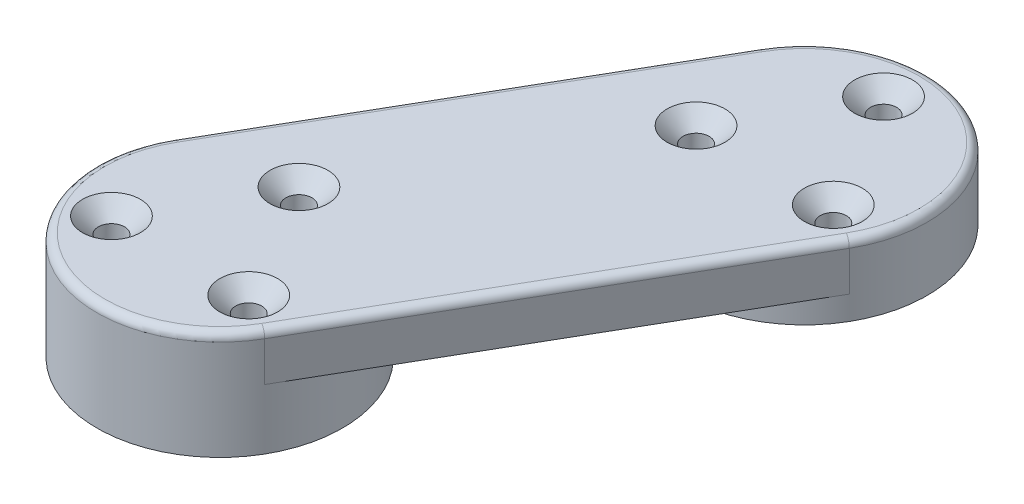
ISO-10303-21;
HEADER;
FILE_DESCRIPTION(('STEP AP214'),'2;1');
FILE_NAME('part.step','',(''),(''),'','','');
FILE_SCHEMA(('AUTOMOTIVE_DESIGN { 1 0 10303 214 1 1 1 1 }'));
ENDSEC;
DATA;
#1=APPLICATION_CONTEXT('core data for automotive mechanical design processes');
#2=APPLICATION_PROTOCOL_DEFINITION('international standard','automotive_design',2000,#1);
#3=PRODUCT_CONTEXT('',#1,'mechanical');
#4=PRODUCT('Part','Part','',(#3));
#5=PRODUCT_RELATED_PRODUCT_CATEGORY('part','',(#4));
#6=PRODUCT_DEFINITION_FORMATION('','',#4);
#7=PRODUCT_DEFINITION_CONTEXT('part definition',#1,'design');
#8=PRODUCT_DEFINITION('design','',#6,#7);
#9=PRODUCT_DEFINITION_SHAPE('','',#8);
#10=(LENGTH_UNIT() NAMED_UNIT(*) SI_UNIT(.MILLI.,.METRE.));
#11=(NAMED_UNIT(*) PLANE_ANGLE_UNIT() SI_UNIT($,.RADIAN.));
#12=(NAMED_UNIT(*) SI_UNIT($,.STERADIAN.) SOLID_ANGLE_UNIT());
#13=UNCERTAINTY_MEASURE_WITH_UNIT(LENGTH_MEASURE(1.E-05),#10,'distance_accuracy_value','');
#14=(GEOMETRIC_REPRESENTATION_CONTEXT(3) GLOBAL_UNCERTAINTY_ASSIGNED_CONTEXT((#13)) GLOBAL_UNIT_ASSIGNED_CONTEXT((#10,
#11,#12)) REPRESENTATION_CONTEXT('',''));
#15=CARTESIAN_POINT('',(0.,0.,0.));
#16=DIRECTION('',(0.,0.,1.));
#17=DIRECTION('',(1.,0.,0.));
#18=AXIS2_PLACEMENT_3D('',#15,#16,#17);
#19=CARTESIAN_POINT('',(2.25126265847072,-64.,-99.5141091458864));
#20=DIRECTION('',(0.,-1.,0.));
#21=DIRECTION('',(0.,0.,-1.));
#22=AXIS2_PLACEMENT_3D('',#19,#20,#21);
#23=PLANE('',#22);
#24=CARTESIAN_POINT('',(2.25126265847072,-64.,-99.5141091458864));
#25=DIRECTION('',(0.,-1.,0.));
#26=DIRECTION('',(0.5,0.,-0.86602540378444));
#27=AXIS2_PLACEMENT_3D('',#24,#25,#26);
#28=CIRCLE('',#27,13.55);
#29=CARTESIAN_POINT('',(9.0262626584707,-64.,-111.248753367166));
#30=VERTEX_POINT('',#29);
#31=EDGE_CURVE('E10',#30,#30,#28,.T.);
#32=ORIENTED_EDGE('',*,*,#31,.F.);
#33=EDGE_LOOP('',(#32));
#34=FACE_BOUND('',#33,.T.);
#35=CARTESIAN_POINT('',(2.25126265847072,-64.,-99.5141091458864));
#36=DIRECTION('',(0.,-1.,0.));
#37=DIRECTION('',(0.5,0.,-0.86602540378444));
#38=AXIS2_PLACEMENT_3D('',#35,#36,#37);
#39=CIRCLE('',#38,15.4999999999947);
#40=CARTESIAN_POINT('',(10.0012626584681,-64.,-112.937502904541));
#41=VERTEX_POINT('',#40);
#42=EDGE_CURVE('E227',#41,#41,#39,.T.);
#43=ORIENTED_EDGE('',*,*,#42,.T.);
#44=EDGE_LOOP('',(#43));
#45=FACE_BOUND('',#44,.T.);
#46=ADVANCED_FACE('F15',(#34,#45),#23,.T.);
#47=CARTESIAN_POINT('',(2.25126265847072,-64.,-99.5141091458864));
#48=DIRECTION('',(0.,1.,0.));
#49=DIRECTION('',(-0.5,0.,0.86602540378444));
#50=AXIS2_PLACEMENT_3D('',#47,#48,#49);
#51=CYLINDRICAL_SURFACE('',#50,13.55);
#52=CARTESIAN_POINT('',(2.25126265847072,-63.,-99.5141091458864));
#53=DIRECTION('',(0.,-1.,0.));
#54=DIRECTION('',(0.5,0.,-0.86602540378444));
#55=AXIS2_PLACEMENT_3D('',#52,#53,#54);
#56=CIRCLE('',#55,13.55);
#57=CARTESIAN_POINT('',(9.0262626584707,-63.,-111.248753367166));
#58=VERTEX_POINT('',#57);
#59=EDGE_CURVE('E194',#58,#58,#56,.T.);
#60=ORIENTED_EDGE('',*,*,#59,.F.);
#61=EDGE_LOOP('',(#60));
#62=FACE_BOUND('',#61,.T.);
#63=ORIENTED_EDGE('',*,*,#31,.T.);
#64=EDGE_LOOP('',(#63));
#65=FACE_BOUND('',#64,.T.);
#66=ADVANCED_FACE('F381',(#62,#65),#51,.F.);
#67=CARTESIAN_POINT('',(2.25126265847072,-56.,-99.5141091458864));
#68=DIRECTION('',(0.,1.,0.));
#69=DIRECTION('',(-0.5,0.,0.86602540378444));
#70=AXIS2_PLACEMENT_3D('',#67,#68,#69);
#71=TOROIDAL_SURFACE('',#70,14.4999999999947,1.);
#72=CARTESIAN_POINT('',(14.8086310133405,-56.,-92.2641091458891));
#73=DIRECTION('',(0.5,0.,-0.86602540378444));
#74=DIRECTION('',(0.,1.,0.));
#75=AXIS2_PLACEMENT_3D('',#72,#73,#74);
#76=CIRCLE('',#75,1.);
#77=CARTESIAN_POINT('',(14.8086310133405,-55.,-92.2641091458891));
#78=VERTEX_POINT('',#77);
#79=CARTESIAN_POINT('',(15.6746564171249,-56.,-91.7641091458891));
#80=VERTEX_POINT('',#79);
#81=EDGE_CURVE('E233',#78,#80,#76,.T.);
#82=ORIENTED_EDGE('',*,*,#81,.T.);
#83=CARTESIAN_POINT('',(2.25126265847072,-56.,-99.5141091458864));
#84=DIRECTION('',(0.,-1.,0.));
#85=DIRECTION('',(-0.5,0.,0.86602540378444));
#86=AXIS2_PLACEMENT_3D('',#83,#84,#85);
#87=CIRCLE('',#86,15.4999999999947);
#88=CARTESIAN_POINT('',(-11.1721311001835,-56.,-107.264109145884));
#89=VERTEX_POINT('',#88);
#90=EDGE_CURVE('E208',#89,#80,#87,.T.);
#91=ORIENTED_EDGE('',*,*,#90,.F.);
#92=CARTESIAN_POINT('',(-10.3061056963991,-56.,-106.764109145884));
#93=DIRECTION('',(0.5,0.,-0.86602540378444));
#94=DIRECTION('',(0.,1.,0.));
#95=AXIS2_PLACEMENT_3D('',#92,#93,#94);
#96=CIRCLE('',#95,1.);
#97=CARTESIAN_POINT('',(-10.3061056963991,-55.,-106.764109145884));
#98=VERTEX_POINT('',#97);
#99=EDGE_CURVE('E23',#89,#98,#96,.T.);
#100=ORIENTED_EDGE('',*,*,#99,.T.);
#101=CARTESIAN_POINT('',(2.25126265847072,-55.,-99.5141091458864));
#102=DIRECTION('',(0.,1.,0.));
#103=DIRECTION('',(-0.5,0.,0.86602540378444));
#104=AXIS2_PLACEMENT_3D('',#101,#102,#103);
#105=CIRCLE('',#104,14.4999999999947);
#106=EDGE_CURVE('E244',#78,#98,#105,.T.);
#107=ORIENTED_EDGE('',*,*,#106,.F.);
#108=EDGE_LOOP('',(#82,#91,#100,#107));
#109=FACE_BOUND('',#108,.T.);
#110=ADVANCED_FACE('F323',(#109),#71,.T.);
#111=CARTESIAN_POINT('',(-10.3061056963991,-56.,-106.764109145884));
#112=DIRECTION('',(-0.5,0.,0.86602540378444));
#113=DIRECTION('',(0.,-1.,0.));
#114=AXIS2_PLACEMENT_3D('',#111,#112,#113);
#115=CYLINDRICAL_SURFACE('',#114,1.);
#116=CARTESIAN_POINT('',(-37.3061056963989,-56.,-59.9987373415241));
#117=DIRECTION('',(0.5,0.,-0.866025403784438));
#118=DIRECTION('',(0.866025403784438,0.,0.5));
#119=AXIS2_PLACEMENT_3D('',#116,#117,#118);
#120=CIRCLE('',#119,1.);
#121=CARTESIAN_POINT('',(-38.1721311001834,-56.,-60.4987373415241));
#122=VERTEX_POINT('',#121);
#123=CARTESIAN_POINT('',(-37.306105696399,-55.,-59.9987373415241));
#124=VERTEX_POINT('',#123);
#125=EDGE_CURVE('E234',#122,#124,#120,.T.);
#126=ORIENTED_EDGE('',*,*,#125,.T.);
#127=DIRECTION('',(-0.5,0.,0.86602540378444));
#128=VECTOR('',#127,1.);
#129=CARTESIAN_POINT('',(-10.3061056963991,-55.,-106.764109145884));
#130=LINE('',#129,#128);
#131=EDGE_CURVE('E248',#98,#124,#130,.T.);
#132=ORIENTED_EDGE('',*,*,#131,.F.);
#133=ORIENTED_EDGE('',*,*,#99,.F.);
#134=DIRECTION('',(0.5,0.,-0.86602540378444));
#135=VECTOR('',#134,1.);
#136=CARTESIAN_POINT('',(-11.1721311001835,-56.,-107.264109145884));
#137=LINE('',#136,#135);
#138=EDGE_CURVE('E308',#122,#89,#137,.T.);
#139=ORIENTED_EDGE('',*,*,#138,.F.);
#140=EDGE_LOOP('',(#126,#132,#133,#139));
#141=FACE_BOUND('',#140,.T.);
#142=ADVANCED_FACE('F326',(#141),#115,.T.);
#143=CARTESIAN_POINT('',(14.8086310133405,-56.,-92.2641091458891));
#144=DIRECTION('',(0.5,0.,-0.86602540378444));
#145=DIRECTION('',(0.,1.,0.));
#146=AXIS2_PLACEMENT_3D('',#143,#144,#145);
#147=CYLINDRICAL_SURFACE('',#146,1.);
#148=CARTESIAN_POINT('',(-12.1913689866594,-56.,-45.4987373415293));
#149=DIRECTION('',(0.5,0.,-0.86602540378444));
#150=DIRECTION('',(0.,1.,0.));
#151=AXIS2_PLACEMENT_3D('',#148,#149,#150);
#152=CIRCLE('',#151,1.);
#153=CARTESIAN_POINT('',(-12.1913689866594,-55.,-45.4987373415293));
#154=VERTEX_POINT('',#153);
#155=CARTESIAN_POINT('',(-11.325343582875,-56.,-44.9987373415293));
#156=VERTEX_POINT('',#155);
#157=EDGE_CURVE('E230',#154,#156,#152,.T.);
#158=ORIENTED_EDGE('',*,*,#157,.T.);
#159=DIRECTION('',(-0.5,0.,0.86602540378444));
#160=VECTOR('',#159,1.);
#161=CARTESIAN_POINT('',(-11.325343582875,-56.,-44.9987373415293));
#162=LINE('',#161,#160);
#163=EDGE_CURVE('E299',#80,#156,#162,.T.);
#164=ORIENTED_EDGE('',*,*,#163,.F.);
#165=ORIENTED_EDGE('',*,*,#81,.F.);
#166=DIRECTION('',(0.5,0.,-0.86602540378444));
#167=VECTOR('',#166,1.);
#168=CARTESIAN_POINT('',(14.8086310133405,-55.,-92.2641091458891));
#169=LINE('',#168,#167);
#170=EDGE_CURVE('E249',#154,#78,#169,.T.);
#171=ORIENTED_EDGE('',*,*,#170,.F.);
#172=EDGE_LOOP('',(#158,#164,#165,#171));
#173=FACE_BOUND('',#172,.T.);
#174=ADVANCED_FACE('F333',(#173),#147,.T.);
#175=CARTESIAN_POINT('',(-24.7487373415292,-56.,-52.7487373415267));
#176=DIRECTION('',(0.,1.,0.));
#177=DIRECTION('',(-0.5,0.,0.866025403784439));
#178=AXIS2_PLACEMENT_3D('',#175,#176,#177);
#179=TOROIDAL_SURFACE('',#178,14.4999999999947,1.);
#180=ORIENTED_EDGE('',*,*,#125,.F.);
#181=CARTESIAN_POINT('',(-24.7487373415292,-56.,-52.7487373415267));
#182=DIRECTION('',(0.,-1.,0.));
#183=DIRECTION('',(-0.5,0.,0.866025403784439));
#184=AXIS2_PLACEMENT_3D('',#181,#182,#183);
#185=CIRCLE('',#184,15.4999999999947);
#186=EDGE_CURVE('E217',#156,#122,#185,.T.);
#187=ORIENTED_EDGE('',*,*,#186,.F.);
#188=ORIENTED_EDGE('',*,*,#157,.F.);
#189=CARTESIAN_POINT('',(-24.7487373415292,-55.,-52.7487373415267));
#190=DIRECTION('',(0.,1.,0.));
#191=DIRECTION('',(-0.5,0.,0.86602540378444));
#192=AXIS2_PLACEMENT_3D('',#189,#190,#191);
#193=CIRCLE('',#192,14.4999999999947);
#194=EDGE_CURVE('E191',#124,#154,#193,.T.);
#195=ORIENTED_EDGE('',*,*,#194,.F.);
#196=EDGE_LOOP('',(#180,#187,#188,#195));
#197=FACE_BOUND('',#196,.T.);
#198=ADVANCED_FACE('F408',(#197),#179,.T.);
#199=CARTESIAN_POINT('',(-24.7487373415292,-61.,-52.7487373415267));
#200=DIRECTION('',(0.,-1.,0.));
#201=DIRECTION('',(0.,0.,-1.));
#202=AXIS2_PLACEMENT_3D('',#199,#200,#201);
#203=PLANE('',#202);
#204=CARTESIAN_POINT('',(-24.7487373415292,-61.,-52.7487373415267));
#205=DIRECTION('',(0.,-1.,0.));
#206=DIRECTION('',(0.5,0.,-0.866025403784439));
#207=AXIS2_PLACEMENT_3D('',#204,#205,#206);
#208=CIRCLE('',#207,15.4999999999947);
#209=CARTESIAN_POINT('',(-38.1721311001834,-61.,-60.4987373415241));
#210=VERTEX_POINT('',#209);
#211=CARTESIAN_POINT('',(-11.325343582875,-61.,-44.9987373415293));
#212=VERTEX_POINT('',#211);
#213=EDGE_CURVE('E274',#210,#212,#208,.T.);
#214=ORIENTED_EDGE('',*,*,#213,.F.);
#215=DIRECTION('',(-0.5,0.,0.86602540378444));
#216=VECTOR('',#215,1.);
#217=CARTESIAN_POINT('',(-11.1721311001835,-61.,-107.264109145884));
#218=LINE('',#217,#216);
#219=CARTESIAN_POINT('',(-11.1721311001835,-61.,-107.264109145884));
#220=VERTEX_POINT('',#219);
#221=EDGE_CURVE('E312',#220,#210,#218,.T.);
#222=ORIENTED_EDGE('',*,*,#221,.F.);
#223=CARTESIAN_POINT('',(2.25126265847072,-61.,-99.5141091458864));
#224=DIRECTION('',(0.,-1.,0.));
#225=DIRECTION('',(-0.5,0.,0.86602540378444));
#226=AXIS2_PLACEMENT_3D('',#223,#224,#225);
#227=CIRCLE('',#226,15.4999999999947);
#228=CARTESIAN_POINT('',(15.6746564171249,-61.,-91.7641091458891));
#229=VERTEX_POINT('',#228);
#230=EDGE_CURVE('E222',#229,#220,#227,.T.);
#231=ORIENTED_EDGE('',*,*,#230,.F.);
#232=DIRECTION('',(0.5,0.,-0.86602540378444));
#233=VECTOR('',#232,1.);
#234=CARTESIAN_POINT('',(-11.325343582875,-61.,-44.9987373415293));
#235=LINE('',#234,#233);
#236=EDGE_CURVE('E303',#212,#229,#235,.T.);
#237=ORIENTED_EDGE('',*,*,#236,.F.);
#238=EDGE_LOOP('',(#214,#222,#231,#237));
#239=FACE_BOUND('',#238,.T.);
#240=ADVANCED_FACE('F490',(#239),#203,.T.);
#241=CARTESIAN_POINT('',(-11.1721311001835,-61.,-107.264109145884));
#242=DIRECTION('',(-0.86602540378444,0.,-0.5));
#243=DIRECTION('',(-0.5,0.,0.86602540378444));
#244=AXIS2_PLACEMENT_3D('',#241,#242,#243);
#245=PLANE('',#244);
#246=DIRECTION('',(0.,1.,0.));
#247=VECTOR('',#246,1.);
#248=CARTESIAN_POINT('',(-38.1721311001834,-61.,-60.4987373415241));
#249=LINE('',#248,#247);
#250=EDGE_CURVE('E270',#210,#122,#249,.T.);
#251=ORIENTED_EDGE('',*,*,#250,.T.);
#252=ORIENTED_EDGE('',*,*,#138,.T.);
#253=DIRECTION('',(0.,1.,0.));
#254=VECTOR('',#253,1.);
#255=CARTESIAN_POINT('',(-11.1721311001835,-61.,-107.264109145884));
#256=LINE('',#255,#254);
#257=EDGE_CURVE('E197',#220,#89,#256,.T.);
#258=ORIENTED_EDGE('',*,*,#257,.F.);
#259=ORIENTED_EDGE('',*,*,#221,.T.);
#260=EDGE_LOOP('',(#251,#252,#258,#259));
#261=FACE_BOUND('',#260,.T.);
#262=ADVANCED_FACE('F345',(#261),#245,.T.);
#263=CARTESIAN_POINT('',(-11.325343582875,-61.,-44.9987373415293));
#264=DIRECTION('',(0.86602540378444,0.,0.5));
#265=DIRECTION('',(0.,-1.,0.));
#266=AXIS2_PLACEMENT_3D('',#263,#264,#265);
#267=PLANE('',#266);
#268=DIRECTION('',(0.,1.,0.));
#269=VECTOR('',#268,1.);
#270=CARTESIAN_POINT('',(15.6746564171249,-61.,-91.7641091458891));
#271=LINE('',#270,#269);
#272=EDGE_CURVE('E212',#229,#80,#271,.T.);
#273=ORIENTED_EDGE('',*,*,#272,.T.);
#274=ORIENTED_EDGE('',*,*,#163,.T.);
#275=DIRECTION('',(0.,1.,0.));
#276=VECTOR('',#275,1.);
#277=CARTESIAN_POINT('',(-11.325343582875,-61.,-44.9987373415293));
#278=LINE('',#277,#276);
#279=EDGE_CURVE('E213',#212,#156,#278,.T.);
#280=ORIENTED_EDGE('',*,*,#279,.F.);
#281=ORIENTED_EDGE('',*,*,#236,.T.);
#282=EDGE_LOOP('',(#273,#274,#280,#281));
#283=FACE_BOUND('',#282,.T.);
#284=ADVANCED_FACE('F339',(#283),#267,.T.);
#285=CARTESIAN_POINT('',(-24.7487373415292,-68.6,-52.7487373415267));
#286=DIRECTION('',(0.,-1.,0.));
#287=DIRECTION('',(0.,0.,-1.));
#288=AXIS2_PLACEMENT_3D('',#285,#286,#287);
#289=PLANE('',#288);
#290=CARTESIAN_POINT('',(-24.7487373415292,-68.6,-52.7487373415267));
#291=DIRECTION('',(0.,-1.,0.));
#292=DIRECTION('',(0.5,0.,-0.86602540378444));
#293=AXIS2_PLACEMENT_3D('',#290,#291,#292);
#294=CIRCLE('',#293,13.6);
#295=CARTESIAN_POINT('',(-17.9487373415292,-68.6,-64.5266828329951));
#296=VERTEX_POINT('',#295);
#297=EDGE_CURVE('E38',#296,#296,#294,.T.);
#298=ORIENTED_EDGE('',*,*,#297,.F.);
#299=EDGE_LOOP('',(#298));
#300=FACE_BOUND('',#299,.T.);
#301=CARTESIAN_POINT('',(-24.7487373415292,-68.6,-52.7487373415267));
#302=DIRECTION('',(0.,-1.,0.));
#303=DIRECTION('',(0.5,0.,-0.866025403784439));
#304=AXIS2_PLACEMENT_3D('',#301,#302,#303);
#305=CIRCLE('',#304,15.4999999999947);
#306=CARTESIAN_POINT('',(-16.9987373415319,-68.6,-66.1721311001809));
#307=VERTEX_POINT('',#306);
#308=EDGE_CURVE('E218',#307,#307,#305,.T.);
#309=ORIENTED_EDGE('',*,*,#308,.T.);
#310=EDGE_LOOP('',(#309));
#311=FACE_BOUND('',#310,.T.);
#312=ADVANCED_FACE('F368',(#300,#311),#289,.T.);
#313=CARTESIAN_POINT('',(-24.7487373415292,-68.6,-52.7487373415267));
#314=DIRECTION('',(0.,1.,0.));
#315=DIRECTION('',(-0.5,0.,0.86602540378444));
#316=AXIS2_PLACEMENT_3D('',#313,#314,#315);
#317=CYLINDRICAL_SURFACE('',#316,13.6);
#318=CARTESIAN_POINT('',(-24.7487373415292,-67.6,-52.7487373415267));
#319=DIRECTION('',(0.,-1.,0.));
#320=DIRECTION('',(0.5,0.,-0.86602540378444));
#321=AXIS2_PLACEMENT_3D('',#318,#319,#320);
#322=CIRCLE('',#321,13.6);
#323=CARTESIAN_POINT('',(-17.9487373415292,-67.6,-64.5266828329951));
#324=VERTEX_POINT('',#323);
#325=EDGE_CURVE('E287',#324,#324,#322,.T.);
#326=ORIENTED_EDGE('',*,*,#325,.F.);
#327=EDGE_LOOP('',(#326));
#328=FACE_BOUND('',#327,.T.);
#329=ORIENTED_EDGE('',*,*,#297,.T.);
#330=EDGE_LOOP('',(#329));
#331=FACE_BOUND('',#330,.T.);
#332=ADVANCED_FACE('F365',(#328,#331),#317,.F.);
#333=CARTESIAN_POINT('',(-24.7487373415292,-57.,-62.7487373415267));
#334=DIRECTION('',(0.,1.,0.));
#335=DIRECTION('',(-0.5,0.,0.86602540378444));
#336=AXIS2_PLACEMENT_3D('',#333,#334,#335);
#337=CONICAL_SURFACE('',#336,1.65,0.7853981625);
#338=CARTESIAN_POINT('',(-24.7487373415292,-57.,-62.7487373415267));
#339=DIRECTION('',(0.,1.,0.));
#340=DIRECTION('',(0.5,0.,-0.866025403784439));
#341=AXIS2_PLACEMENT_3D('',#338,#339,#340);
#342=CIRCLE('',#341,1.65);
#343=CARTESIAN_POINT('',(-23.9237373415293,-57.,-64.177679257771));
#344=VERTEX_POINT('',#343);
#345=EDGE_CURVE('E294',#344,#344,#342,.T.);
#346=ORIENTED_EDGE('',*,*,#345,.F.);
#347=EDGE_LOOP('',(#346));
#348=FACE_BOUND('',#347,.T.);
#349=CARTESIAN_POINT('',(-24.7487373415292,-55.,-62.7487373415267));
#350=DIRECTION('',(0.,-1.,0.));
#351=DIRECTION('',(0.5,0.,-0.86602540378444));
#352=AXIS2_PLACEMENT_3D('',#349,#350,#351);
#353=CIRCLE('',#352,3.65);
#354=CARTESIAN_POINT('',(-22.9237373415293,-55.,-65.9097300653399));
#355=VERTEX_POINT('',#354);
#356=EDGE_CURVE('E265',#355,#355,#353,.T.);
#357=ORIENTED_EDGE('',*,*,#356,.F.);
#358=EDGE_LOOP('',(#357));
#359=FACE_BOUND('',#358,.T.);
#360=ADVANCED_FACE('F367',(#348,#359),#337,.F.);
#361=CARTESIAN_POINT('',(-33.4089913793736,-57.,-47.7487373415266));
#362=DIRECTION('',(0.,1.,0.));
#363=DIRECTION('',(-0.5,0.,0.86602540378444));
#364=AXIS2_PLACEMENT_3D('',#361,#362,#363);
#365=CONICAL_SURFACE('',#364,1.65,0.7853981625);
#366=CARTESIAN_POINT('',(-33.4089913793736,-57.,-47.7487373415266));
#367=DIRECTION('',(0.,1.,0.));
#368=DIRECTION('',(0.5,0.,-0.866025403784439));
#369=AXIS2_PLACEMENT_3D('',#366,#367,#368);
#370=CIRCLE('',#369,1.65);
#371=CARTESIAN_POINT('',(-32.5839913793736,-57.,-49.177679257771));
#372=VERTEX_POINT('',#371);
#373=EDGE_CURVE('E288',#372,#372,#370,.T.);
#374=ORIENTED_EDGE('',*,*,#373,.F.);
#375=EDGE_LOOP('',(#374));
#376=FACE_BOUND('',#375,.T.);
#377=CARTESIAN_POINT('',(-33.4089913793736,-55.,-47.7487373415266));
#378=DIRECTION('',(0.,-1.,0.));
#379=DIRECTION('',(0.5,0.,-0.86602540378444));
#380=AXIS2_PLACEMENT_3D('',#377,#378,#379);
#381=CIRCLE('',#380,3.65);
#382=CARTESIAN_POINT('',(-31.5839913793736,-55.,-50.9097300653398));
#383=VERTEX_POINT('',#382);
#384=EDGE_CURVE('E262',#383,#383,#381,.T.);
#385=ORIENTED_EDGE('',*,*,#384,.F.);
#386=EDGE_LOOP('',(#385));
#387=FACE_BOUND('',#386,.T.);
#388=ADVANCED_FACE('F375',(#376,#387),#365,.F.);
#389=CARTESIAN_POINT('',(-16.0884833036848,-57.,-47.7487373415267));
#390=DIRECTION('',(0.,1.,0.));
#391=DIRECTION('',(-0.5,0.,0.86602540378444));
#392=AXIS2_PLACEMENT_3D('',#389,#390,#391);
#393=CONICAL_SURFACE('',#392,1.65,0.7853981625);
#394=CARTESIAN_POINT('',(-16.0884833036848,-57.,-47.7487373415267));
#395=DIRECTION('',(0.,1.,0.));
#396=DIRECTION('',(0.5,0.,-0.86602540378444));
#397=AXIS2_PLACEMENT_3D('',#394,#395,#396);
#398=CIRCLE('',#397,1.65);
#399=CARTESIAN_POINT('',(-15.2634833036848,-57.,-49.177679257771));
#400=VERTEX_POINT('',#399);
#401=EDGE_CURVE('E291',#400,#400,#398,.T.);
#402=ORIENTED_EDGE('',*,*,#401,.F.);
#403=EDGE_LOOP('',(#402));
#404=FACE_BOUND('',#403,.T.);
#405=CARTESIAN_POINT('',(-16.0884833036848,-55.,-47.7487373415267));
#406=DIRECTION('',(0.,-1.,0.));
#407=DIRECTION('',(0.5,0.,-0.86602540378444));
#408=AXIS2_PLACEMENT_3D('',#405,#406,#407);
#409=CIRCLE('',#408,3.65);
#410=CARTESIAN_POINT('',(-14.2634833036848,-55.,-50.9097300653399));
#411=VERTEX_POINT('',#410);
#412=EDGE_CURVE('E201',#411,#411,#409,.T.);
#413=ORIENTED_EDGE('',*,*,#412,.F.);
#414=EDGE_LOOP('',(#413));
#415=FACE_BOUND('',#414,.T.);
#416=ADVANCED_FACE('F405',(#404,#415),#393,.F.);
#417=CARTESIAN_POINT('',(-24.7487373415292,57.14,-62.7487373415267));
#418=DIRECTION('',(0.,-1.,0.));
#419=DIRECTION('',(0.5,0.,-0.866025403784439));
#420=AXIS2_PLACEMENT_3D('',#417,#418,#419);
#421=CYLINDRICAL_SURFACE('',#420,1.65);
#422=CARTESIAN_POINT('',(-24.7487373415292,-67.6,-62.7487373415267));
#423=DIRECTION('',(0.,-1.,0.));
#424=DIRECTION('',(-1.,0.,0.));
#425=AXIS2_PLACEMENT_3D('',#422,#423,#424);
#426=CIRCLE('',#425,1.65);
#427=CARTESIAN_POINT('',(-26.3987373415292,-67.6,-62.7487373415267));
#428=VERTEX_POINT('',#427);
#429=EDGE_CURVE('E284',#428,#428,#426,.T.);
#430=ORIENTED_EDGE('',*,*,#429,.T.);
#431=EDGE_LOOP('',(#430));
#432=FACE_BOUND('',#431,.T.);
#433=ORIENTED_EDGE('',*,*,#345,.T.);
#434=EDGE_LOOP('',(#433));
#435=FACE_BOUND('',#434,.T.);
#436=ADVANCED_FACE('F438',(#432,#435),#421,.F.);
#437=CARTESIAN_POINT('',(-16.0884833036848,57.14,-47.7487373415267));
#438=DIRECTION('',(0.,-1.,0.));
#439=DIRECTION('',(0.5,0.,-0.86602540378444));
#440=AXIS2_PLACEMENT_3D('',#437,#438,#439);
#441=CYLINDRICAL_SURFACE('',#440,1.65);
#442=CARTESIAN_POINT('',(-16.0884833036848,-67.6,-47.7487373415267));
#443=DIRECTION('',(0.,-1.,0.));
#444=DIRECTION('',(0.5,0.,-0.86602540378444));
#445=AXIS2_PLACEMENT_3D('',#442,#443,#444);
#446=CIRCLE('',#445,1.65);
#447=CARTESIAN_POINT('',(-15.2634833036848,-67.6,-49.177679257771));
#448=VERTEX_POINT('',#447);
#449=EDGE_CURVE('E281',#448,#448,#446,.T.);
#450=ORIENTED_EDGE('',*,*,#449,.T.);
#451=EDGE_LOOP('',(#450));
#452=FACE_BOUND('',#451,.T.);
#453=ORIENTED_EDGE('',*,*,#401,.T.);
#454=EDGE_LOOP('',(#453));
#455=FACE_BOUND('',#454,.T.);
#456=ADVANCED_FACE('F435',(#452,#455),#441,.F.);
#457=CARTESIAN_POINT('',(-33.4089913793736,57.14,-47.7487373415266));
#458=DIRECTION('',(0.,-1.,0.));
#459=DIRECTION('',(0.5,0.,-0.866025403784439));
#460=AXIS2_PLACEMENT_3D('',#457,#458,#459);
#461=CYLINDRICAL_SURFACE('',#460,1.65);
#462=CARTESIAN_POINT('',(-33.4089913793736,-67.6,-47.7487373415266));
#463=DIRECTION('',(0.,-1.,0.));
#464=DIRECTION('',(0.5,0.,0.866025403784436));
#465=AXIS2_PLACEMENT_3D('',#462,#463,#464);
#466=CIRCLE('',#465,1.65);
#467=CARTESIAN_POINT('',(-32.5839913793736,-67.6,-46.3197954252823));
#468=VERTEX_POINT('',#467);
#469=EDGE_CURVE('E278',#468,#468,#466,.T.);
#470=ORIENTED_EDGE('',*,*,#469,.T.);
#471=EDGE_LOOP('',(#470));
#472=FACE_BOUND('',#471,.T.);
#473=ORIENTED_EDGE('',*,*,#373,.T.);
#474=EDGE_LOOP('',(#473));
#475=FACE_BOUND('',#474,.T.);
#476=ADVANCED_FACE('F428',(#472,#475),#461,.F.);
#477=CARTESIAN_POINT('',(-24.7487373415292,-67.6,-52.7487373415267));
#478=DIRECTION('',(0.,-1.,0.));
#479=DIRECTION('',(0.,0.,-1.));
#480=AXIS2_PLACEMENT_3D('',#477,#478,#479);
#481=PLANE('',#480);
#482=ORIENTED_EDGE('',*,*,#325,.T.);
#483=EDGE_LOOP('',(#482));
#484=FACE_BOUND('',#483,.T.);
#485=ORIENTED_EDGE('',*,*,#429,.F.);
#486=EDGE_LOOP('',(#485));
#487=FACE_BOUND('',#486,.T.);
#488=ORIENTED_EDGE('',*,*,#449,.F.);
#489=EDGE_LOOP('',(#488));
#490=FACE_BOUND('',#489,.T.);
#491=ORIENTED_EDGE('',*,*,#469,.F.);
#492=EDGE_LOOP('',(#491));
#493=FACE_BOUND('',#492,.T.);
#494=ADVANCED_FACE('F362',(#484,#487,#490,#493),#481,.T.);
#495=CARTESIAN_POINT('',(-24.7487373415292,-67.6,-52.7487373415267));
#496=DIRECTION('',(0.,1.,0.));
#497=DIRECTION('',(-0.5,0.,0.866025403784439));
#498=AXIS2_PLACEMENT_3D('',#495,#496,#497);
#499=CYLINDRICAL_SURFACE('',#498,15.4999999999947);
#500=ORIENTED_EDGE('',*,*,#279,.T.);
#501=ORIENTED_EDGE('',*,*,#186,.T.);
#502=ORIENTED_EDGE('',*,*,#250,.F.);
#503=ORIENTED_EDGE('',*,*,#213,.T.);
#504=EDGE_LOOP('',(#500,#501,#502,#503));
#505=FACE_BOUND('',#504,.T.);
#506=ORIENTED_EDGE('',*,*,#308,.F.);
#507=EDGE_LOOP('',(#506));
#508=FACE_BOUND('',#507,.T.);
#509=ADVANCED_FACE('F350',(#505,#508),#499,.T.);
#510=CARTESIAN_POINT('',(-6.40899137937366,-55.,-94.5141091458864));
#511=DIRECTION('',(0.,1.,0.));
#512=DIRECTION('',(-0.5,0.,0.86602540378444));
#513=AXIS2_PLACEMENT_3D('',#510,#511,#512);
#514=CONICAL_SURFACE('',#513,3.65,0.7853981625);
#515=CARTESIAN_POINT('',(-6.40899137937366,-55.,-94.5141091458864));
#516=DIRECTION('',(0.,1.,0.));
#517=DIRECTION('',(-0.5,0.,0.86602540378444));
#518=AXIS2_PLACEMENT_3D('',#515,#516,#517);
#519=CIRCLE('',#518,3.65);
#520=CARTESIAN_POINT('',(-8.23399137937366,-55.,-91.3531164220732));
#521=VERTEX_POINT('',#520);
#522=EDGE_CURVE('E198',#521,#521,#519,.T.);
#523=ORIENTED_EDGE('',*,*,#522,.T.);
#524=EDGE_LOOP('',(#523));
#525=FACE_BOUND('',#524,.T.);
#526=CARTESIAN_POINT('',(-6.40899137937366,-57.,-94.5141091458864));
#527=DIRECTION('',(0.,-1.,0.));
#528=DIRECTION('',(-0.5,0.,0.866025403784439));
#529=AXIS2_PLACEMENT_3D('',#526,#527,#528);
#530=CIRCLE('',#529,1.65);
#531=CARTESIAN_POINT('',(-7.23399137937366,-57.,-93.0851672296421));
#532=VERTEX_POINT('',#531);
#533=EDGE_CURVE('E226',#532,#532,#530,.T.);
#534=ORIENTED_EDGE('',*,*,#533,.T.);
#535=EDGE_LOOP('',(#534));
#536=FACE_BOUND('',#535,.T.);
#537=ADVANCED_FACE('F422',(#525,#536),#514,.F.);
#538=CARTESIAN_POINT('',(2.25126265847074,-55.,-109.514109145886));
#539=DIRECTION('',(0.,1.,0.));
#540=DIRECTION('',(-0.5,0.,0.86602540378444));
#541=AXIS2_PLACEMENT_3D('',#538,#539,#540);
#542=CONICAL_SURFACE('',#541,3.65,0.7853981625);
#543=CARTESIAN_POINT('',(2.25126265847074,-55.,-109.514109145886));
#544=DIRECTION('',(0.,1.,0.));
#545=DIRECTION('',(-0.5,0.,0.86602540378444));
#546=AXIS2_PLACEMENT_3D('',#543,#544,#545);
#547=CIRCLE('',#546,3.65);
#548=CARTESIAN_POINT('',(0.426262658470749,-55.,-106.353116422073));
#549=VERTEX_POINT('',#548);
#550=EDGE_CURVE('E202',#549,#549,#547,.T.);
#551=ORIENTED_EDGE('',*,*,#550,.T.);
#552=EDGE_LOOP('',(#551));
#553=FACE_BOUND('',#552,.T.);
#554=CARTESIAN_POINT('',(2.25126265847074,-57.,-109.514109145886));
#555=DIRECTION('',(0.,-1.,0.));
#556=DIRECTION('',(-0.5,0.,0.866025403784439));
#557=AXIS2_PLACEMENT_3D('',#554,#555,#556);
#558=CIRCLE('',#557,1.65);
#559=CARTESIAN_POINT('',(1.42626265847075,-57.,-108.085167229642));
#560=VERTEX_POINT('',#559);
#561=EDGE_CURVE('E223',#560,#560,#558,.T.);
#562=ORIENTED_EDGE('',*,*,#561,.T.);
#563=EDGE_LOOP('',(#562));
#564=FACE_BOUND('',#563,.T.);
#565=ADVANCED_FACE('F418',(#553,#564),#542,.F.);
#566=CARTESIAN_POINT('',(10.9115166963151,-55.,-94.5141091458864));
#567=DIRECTION('',(0.,1.,0.));
#568=DIRECTION('',(-0.5,0.,0.86602540378444));
#569=AXIS2_PLACEMENT_3D('',#566,#567,#568);
#570=CONICAL_SURFACE('',#569,3.65,0.7853981625);
#571=CARTESIAN_POINT('',(10.9115166963151,-55.,-94.5141091458864));
#572=DIRECTION('',(0.,1.,0.));
#573=DIRECTION('',(-0.5,0.,0.86602540378444));
#574=AXIS2_PLACEMENT_3D('',#571,#572,#573);
#575=CIRCLE('',#574,3.65);
#576=CARTESIAN_POINT('',(9.08651669631512,-55.,-91.3531164220732));
#577=VERTEX_POINT('',#576);
#578=EDGE_CURVE('E238',#577,#577,#575,.T.);
#579=ORIENTED_EDGE('',*,*,#578,.T.);
#580=EDGE_LOOP('',(#579));
#581=FACE_BOUND('',#580,.T.);
#582=CARTESIAN_POINT('',(10.9115166963151,-57.,-94.5141091458864));
#583=DIRECTION('',(0.,-1.,0.));
#584=DIRECTION('',(-0.5,0.,0.866025403784439));
#585=AXIS2_PLACEMENT_3D('',#582,#583,#584);
#586=CIRCLE('',#585,1.65);
#587=CARTESIAN_POINT('',(10.0865166963151,-57.,-93.0851672296421));
#588=VERTEX_POINT('',#587);
#589=EDGE_CURVE('E243',#588,#588,#586,.T.);
#590=ORIENTED_EDGE('',*,*,#589,.T.);
#591=EDGE_LOOP('',(#590));
#592=FACE_BOUND('',#591,.T.);
#593=ADVANCED_FACE('F415',(#581,#592),#570,.F.);
#594=CARTESIAN_POINT('',(2.25126265847072,-55.,-99.5141091458864));
#595=DIRECTION('',(0.,1.,0.));
#596=DIRECTION('',(1.,0.,0.));
#597=AXIS2_PLACEMENT_3D('',#594,#595,#596);
#598=PLANE('',#597);
#599=ORIENTED_EDGE('',*,*,#356,.T.);
#600=EDGE_LOOP('',(#599));
#601=FACE_BOUND('',#600,.T.);
#602=ORIENTED_EDGE('',*,*,#384,.T.);
#603=EDGE_LOOP('',(#602));
#604=FACE_BOUND('',#603,.T.);
#605=ORIENTED_EDGE('',*,*,#412,.T.);
#606=EDGE_LOOP('',(#605));
#607=FACE_BOUND('',#606,.T.);
#608=ORIENTED_EDGE('',*,*,#522,.F.);
#609=EDGE_LOOP('',(#608));
#610=FACE_BOUND('',#609,.T.);
#611=ORIENTED_EDGE('',*,*,#550,.F.);
#612=EDGE_LOOP('',(#611));
#613=FACE_BOUND('',#612,.T.);
#614=ORIENTED_EDGE('',*,*,#578,.F.);
#615=EDGE_LOOP('',(#614));
#616=FACE_BOUND('',#615,.T.);
#617=ORIENTED_EDGE('',*,*,#170,.T.);
#618=ORIENTED_EDGE('',*,*,#106,.T.);
#619=ORIENTED_EDGE('',*,*,#131,.T.);
#620=ORIENTED_EDGE('',*,*,#194,.T.);
#621=EDGE_LOOP('',(#617,#618,#619,#620));
#622=FACE_BOUND('',#621,.T.);
#623=ADVANCED_FACE('F330',(#601,#604,#607,#610,#613,#616,#622),#598,.T.);
#624=CARTESIAN_POINT('',(10.9115166963151,57.14,-94.5141091458864));
#625=DIRECTION('',(0.,-1.,0.));
#626=DIRECTION('',(0.5,0.,-0.866025403784438));
#627=AXIS2_PLACEMENT_3D('',#624,#625,#626);
#628=CYLINDRICAL_SURFACE('',#627,1.65);
#629=CARTESIAN_POINT('',(10.9115166963151,-63.,-94.5141091458864));
#630=DIRECTION('',(0.,-1.,0.));
#631=DIRECTION('',(0.5,0.,-0.866025403784439));
#632=AXIS2_PLACEMENT_3D('',#629,#630,#631);
#633=CIRCLE('',#632,1.65);
#634=CARTESIAN_POINT('',(11.7365166963151,-63.,-95.9430510621307));
#635=VERTEX_POINT('',#634);
#636=EDGE_CURVE('E177',#635,#635,#633,.T.);
#637=ORIENTED_EDGE('',*,*,#636,.T.);
#638=EDGE_LOOP('',(#637));
#639=FACE_BOUND('',#638,.T.);
#640=ORIENTED_EDGE('',*,*,#589,.F.);
#641=EDGE_LOOP('',(#640));
#642=FACE_BOUND('',#641,.T.);
#643=ADVANCED_FACE('F178',(#639,#642),#628,.F.);
#644=CARTESIAN_POINT('',(-6.40899137937366,57.14,-94.5141091458864));
#645=DIRECTION('',(0.,-1.,0.));
#646=DIRECTION('',(0.5,0.,-0.866025403784438));
#647=AXIS2_PLACEMENT_3D('',#644,#645,#646);
#648=CYLINDRICAL_SURFACE('',#647,1.65);
#649=CARTESIAN_POINT('',(-6.40899137937366,-63.,-94.5141091458864));
#650=DIRECTION('',(0.,-1.,0.));
#651=DIRECTION('',(0.5,0.,-0.866025403784439));
#652=AXIS2_PLACEMENT_3D('',#649,#650,#651);
#653=CIRCLE('',#652,1.65);
#654=CARTESIAN_POINT('',(-5.58399137937367,-63.,-95.9430510621308));
#655=VERTEX_POINT('',#654);
#656=EDGE_CURVE('E182',#655,#655,#653,.T.);
#657=ORIENTED_EDGE('',*,*,#656,.T.);
#658=EDGE_LOOP('',(#657));
#659=FACE_BOUND('',#658,.T.);
#660=ORIENTED_EDGE('',*,*,#533,.F.);
#661=EDGE_LOOP('',(#660));
#662=FACE_BOUND('',#661,.T.);
#663=ADVANCED_FACE('F400',(#659,#662),#648,.F.);
#664=CARTESIAN_POINT('',(2.25126265847074,57.14,-109.514109145886));
#665=DIRECTION('',(0.,-1.,0.));
#666=DIRECTION('',(0.5,0.,-0.866025403784438));
#667=AXIS2_PLACEMENT_3D('',#664,#665,#666);
#668=CYLINDRICAL_SURFACE('',#667,1.65);
#669=CARTESIAN_POINT('',(2.25126265847074,-63.,-109.514109145886));
#670=DIRECTION('',(0.,-1.,0.));
#671=DIRECTION('',(0.5,0.,-0.866025403784439));
#672=AXIS2_PLACEMENT_3D('',#669,#670,#671);
#673=CIRCLE('',#672,1.65);
#674=CARTESIAN_POINT('',(3.07626265847074,-63.,-110.943051062131));
#675=VERTEX_POINT('',#674);
#676=EDGE_CURVE('E188',#675,#675,#673,.T.);
#677=ORIENTED_EDGE('',*,*,#676,.T.);
#678=EDGE_LOOP('',(#677));
#679=FACE_BOUND('',#678,.T.);
#680=ORIENTED_EDGE('',*,*,#561,.F.);
#681=EDGE_LOOP('',(#680));
#682=FACE_BOUND('',#681,.T.);
#683=ADVANCED_FACE('F392',(#679,#682),#668,.F.);
#684=CARTESIAN_POINT('',(2.25126265847072,-67.6,-99.5141091458864));
#685=DIRECTION('',(0.,1.,0.));
#686=DIRECTION('',(-0.5,0.,0.86602540378444));
#687=AXIS2_PLACEMENT_3D('',#684,#685,#686);
#688=CYLINDRICAL_SURFACE('',#687,15.4999999999947);
#689=ORIENTED_EDGE('',*,*,#42,.F.);
#690=EDGE_LOOP('',(#689));
#691=FACE_BOUND('',#690,.T.);
#692=ORIENTED_EDGE('',*,*,#257,.T.);
#693=ORIENTED_EDGE('',*,*,#90,.T.);
#694=ORIENTED_EDGE('',*,*,#272,.F.);
#695=ORIENTED_EDGE('',*,*,#230,.T.);
#696=EDGE_LOOP('',(#692,#693,#694,#695));
#697=FACE_BOUND('',#696,.T.);
#698=ADVANCED_FACE('F342',(#691,#697),#688,.T.);
#699=CARTESIAN_POINT('',(2.25126265847072,-63.,-99.5141091458864));
#700=DIRECTION('',(0.,-1.,0.));
#701=DIRECTION('',(0.,0.,-1.));
#702=AXIS2_PLACEMENT_3D('',#699,#700,#701);
#703=PLANE('',#702);
#704=ORIENTED_EDGE('',*,*,#59,.T.);
#705=EDGE_LOOP('',(#704));
#706=FACE_BOUND('',#705,.T.);
#707=ORIENTED_EDGE('',*,*,#676,.F.);
#708=EDGE_LOOP('',(#707));
#709=FACE_BOUND('',#708,.T.);
#710=ORIENTED_EDGE('',*,*,#656,.F.);
#711=EDGE_LOOP('',(#710));
#712=FACE_BOUND('',#711,.T.);
#713=ORIENTED_EDGE('',*,*,#636,.F.);
#714=EDGE_LOOP('',(#713));
#715=FACE_BOUND('',#714,.T.);
#716=ADVANCED_FACE('F391',(#706,#709,#712,#715),#703,.T.);
#717=CLOSED_SHELL('',(#46,#66,#110,#142,#174,#198,#240,#262,#284,#312,#332,#360,#388,#416,#436,
#456,#476,#494,#509,#537,#565,#593,#623,#643,#663,#683,#698,#716));
#718=MANIFOLD_SOLID_BREP('B1',#717);
#719=ADVANCED_BREP_SHAPE_REPRESENTATION('',(#18,#718),#14);
#720=SHAPE_DEFINITION_REPRESENTATION(#9,#719);
ENDSEC;
END-ISO-10303-21;
